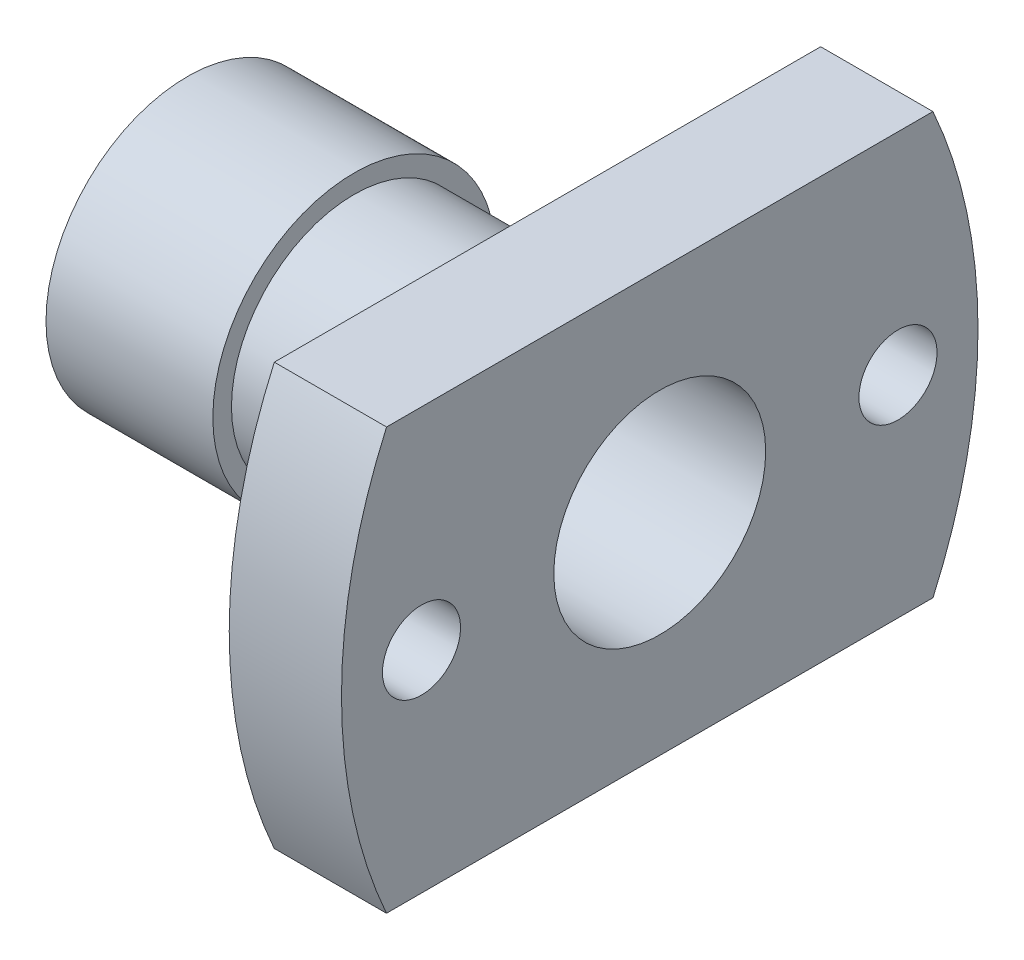
ISO-10303-21;
HEADER;
FILE_DESCRIPTION(('STEP AP214'),'2;1');
FILE_NAME('part.step','',(''),(''),'','','');
FILE_SCHEMA(('AUTOMOTIVE_DESIGN { 1 0 10303 214 1 1 1 1 }'));
ENDSEC;
DATA;
#1=APPLICATION_CONTEXT('core data for automotive mechanical design processes');
#2=APPLICATION_PROTOCOL_DEFINITION('international standard','automotive_design',2000,#1);
#3=PRODUCT_CONTEXT('',#1,'mechanical');
#4=PRODUCT('Part','Part','',(#3));
#5=PRODUCT_RELATED_PRODUCT_CATEGORY('part','',(#4));
#6=PRODUCT_DEFINITION_FORMATION('','',#4);
#7=PRODUCT_DEFINITION_CONTEXT('part definition',#1,'design');
#8=PRODUCT_DEFINITION('design','',#6,#7);
#9=PRODUCT_DEFINITION_SHAPE('','',#8);
#10=(LENGTH_UNIT() NAMED_UNIT(*) SI_UNIT(.MILLI.,.METRE.));
#11=(NAMED_UNIT(*) PLANE_ANGLE_UNIT() SI_UNIT($,.RADIAN.));
#12=(NAMED_UNIT(*) SI_UNIT($,.STERADIAN.) SOLID_ANGLE_UNIT());
#13=UNCERTAINTY_MEASURE_WITH_UNIT(LENGTH_MEASURE(1.E-05),#10,'distance_accuracy_value','');
#14=(GEOMETRIC_REPRESENTATION_CONTEXT(3) GLOBAL_UNCERTAINTY_ASSIGNED_CONTEXT((#13)) GLOBAL_UNIT_ASSIGNED_CONTEXT((#10,
#11,#12)) REPRESENTATION_CONTEXT('',''));
#15=CARTESIAN_POINT('',(0.,0.,0.));
#16=DIRECTION('',(0.,0.,1.));
#17=DIRECTION('',(1.,0.,0.));
#18=AXIS2_PLACEMENT_3D('',#15,#16,#17);
#19=CARTESIAN_POINT('',(-21.59,0.,-14.28));
#20=DIRECTION('',(1.,0.,0.));
#21=DIRECTION('',(0.,0.,-1.));
#22=AXIS2_PLACEMENT_3D('',#19,#20,#21);
#23=CYLINDRICAL_SURFACE('',#22,7.35);
#24=CARTESIAN_POINT('',(0.,0.,-14.28));
#25=DIRECTION('',(1.,0.,0.));
#26=DIRECTION('',(0.,0.,-1.));
#27=AXIS2_PLACEMENT_3D('',#24,#25,#26);
#28=CIRCLE('',#27,7.35);
#29=CARTESIAN_POINT('',(0.,0.,-21.63));
#30=VERTEX_POINT('',#29);
#31=EDGE_CURVE('E81',#30,#30,#28,.F.);
#32=ORIENTED_EDGE('',*,*,#31,.T.);
#33=EDGE_LOOP('',(#32));
#34=FACE_BOUND('',#33,.T.);
#35=CARTESIAN_POINT('',(-11.59,0.,-14.28));
#36=DIRECTION('',(-1.,0.,0.));
#37=DIRECTION('',(0.,0.,1.));
#38=AXIS2_PLACEMENT_3D('',#35,#36,#37);
#39=CIRCLE('',#38,7.35);
#40=CARTESIAN_POINT('',(-11.59,0.,-6.93));
#41=VERTEX_POINT('',#40);
#42=EDGE_CURVE('E12',#41,#41,#39,.T.);
#43=ORIENTED_EDGE('',*,*,#42,.F.);
#44=EDGE_LOOP('',(#43));
#45=FACE_BOUND('',#44,.T.);
#46=ADVANCED_FACE('F72',(#34,#45),#23,.T.);
#47=CARTESIAN_POINT('',(0.,0.,0.));
#48=DIRECTION('',(1.,0.,0.));
#49=DIRECTION('',(0.,0.,-1.));
#50=AXIS2_PLACEMENT_3D('',#47,#48,#49);
#51=PLANE('',#50);
#52=CARTESIAN_POINT('',(0.,0.,-2.5));
#53=DIRECTION('',(-1.,0.,0.));
#54=DIRECTION('',(0.,0.,1.));
#55=AXIS2_PLACEMENT_3D('',#52,#53,#54);
#56=CIRCLE('',#55,30.855);
#57=CARTESIAN_POINT('',(0.,12.625,-30.6538700714484));
#58=VERTEX_POINT('',#57);
#59=CARTESIAN_POINT('',(0.,-12.615,-30.6583522245177));
#60=VERTEX_POINT('',#59);
#61=EDGE_CURVE('E110',#58,#60,#56,.T.);
#62=ORIENTED_EDGE('',*,*,#61,.T.);
#63=DIRECTION('',(0.,0.,1.));
#64=VECTOR('',#63,1.);
#65=CARTESIAN_POINT('',(0.,-12.615,0.));
#66=LINE('',#65,#64);
#67=CARTESIAN_POINT('',(0.,-12.615,2.09835222451768));
#68=VERTEX_POINT('',#67);
#69=EDGE_CURVE('E115',#60,#68,#66,.T.);
#70=ORIENTED_EDGE('',*,*,#69,.T.);
#71=CARTESIAN_POINT('',(0.,0.,-26.06));
#72=DIRECTION('',(-1.,0.,0.));
#73=DIRECTION('',(0.,0.,1.));
#74=AXIS2_PLACEMENT_3D('',#71,#72,#73);
#75=CIRCLE('',#74,30.855);
#76=CARTESIAN_POINT('',(0.,12.625,2.09387007144844));
#77=VERTEX_POINT('',#76);
#78=EDGE_CURVE('E142',#68,#77,#75,.T.);
#79=ORIENTED_EDGE('',*,*,#78,.T.);
#80=DIRECTION('',(0.,0.,-1.));
#81=VECTOR('',#80,1.);
#82=CARTESIAN_POINT('',(0.,12.625,0.));
#83=LINE('',#82,#81);
#84=EDGE_CURVE('E118',#77,#58,#83,.T.);
#85=ORIENTED_EDGE('',*,*,#84,.T.);
#86=EDGE_LOOP('',(#62,#70,#79,#85));
#87=FACE_BOUND('',#86,.T.);
#88=ORIENTED_EDGE('',*,*,#31,.F.);
#89=EDGE_LOOP('',(#88));
#90=FACE_BOUND('',#89,.T.);
#91=CARTESIAN_POINT('',(0.,0.,-28.56));
#92=DIRECTION('',(-1.,0.,0.));
#93=DIRECTION('',(0.,0.,1.));
#94=AXIS2_PLACEMENT_3D('',#91,#92,#93);
#95=CIRCLE('',#94,2.34);
#96=CARTESIAN_POINT('',(0.,0.,-26.22));
#97=VERTEX_POINT('',#96);
#98=EDGE_CURVE('E163',#97,#97,#95,.T.);
#99=ORIENTED_EDGE('',*,*,#98,.F.);
#100=EDGE_LOOP('',(#99));
#101=FACE_BOUND('',#100,.T.);
#102=CARTESIAN_POINT('',(0.,0.,0.));
#103=DIRECTION('',(-1.,0.,0.));
#104=DIRECTION('',(0.,0.,1.));
#105=AXIS2_PLACEMENT_3D('',#102,#103,#104);
#106=CIRCLE('',#105,2.34);
#107=CARTESIAN_POINT('',(0.,0.,2.34));
#108=VERTEX_POINT('',#107);
#109=EDGE_CURVE('E169',#108,#108,#106,.T.);
#110=ORIENTED_EDGE('',*,*,#109,.F.);
#111=EDGE_LOOP('',(#110));
#112=FACE_BOUND('',#111,.T.);
#113=ADVANCED_FACE('F112',(#87,#90,#101,#112),#51,.F.);
#114=CARTESIAN_POINT('',(6.73,0.,0.));
#115=DIRECTION('',(1.,0.,0.));
#116=DIRECTION('',(0.,0.,-1.));
#117=AXIS2_PLACEMENT_3D('',#114,#115,#116);
#118=PLANE('',#117);
#119=CARTESIAN_POINT('',(6.73,0.,-14.28));
#120=DIRECTION('',(-1.,0.,0.));
#121=DIRECTION('',(0.,0.,1.));
#122=AXIS2_PLACEMENT_3D('',#119,#120,#121);
#123=CIRCLE('',#122,6.35);
#124=CARTESIAN_POINT('',(6.73,0.,-7.93));
#125=VERTEX_POINT('',#124);
#126=EDGE_CURVE('E126',#125,#125,#123,.T.);
#127=ORIENTED_EDGE('',*,*,#126,.T.);
#128=EDGE_LOOP('',(#127));
#129=FACE_BOUND('',#128,.T.);
#130=DIRECTION('',(0.,0.,1.));
#131=VECTOR('',#130,1.);
#132=CARTESIAN_POINT('',(6.73,-12.615,0.));
#133=LINE('',#132,#131);
#134=CARTESIAN_POINT('',(6.73,-12.615,-30.6583522245177));
#135=VERTEX_POINT('',#134);
#136=CARTESIAN_POINT('',(6.73,-12.615,2.09835222451768));
#137=VERTEX_POINT('',#136);
#138=EDGE_CURVE('E87',#135,#137,#133,.T.);
#139=ORIENTED_EDGE('',*,*,#138,.F.);
#140=CARTESIAN_POINT('',(6.73,0.,-2.5));
#141=DIRECTION('',(-1.,0.,0.));
#142=DIRECTION('',(0.,0.,1.));
#143=AXIS2_PLACEMENT_3D('',#140,#141,#142);
#144=CIRCLE('',#143,30.855);
#145=CARTESIAN_POINT('',(6.73,12.625,-30.6538700714484));
#146=VERTEX_POINT('',#145);
#147=EDGE_CURVE('E121',#146,#135,#144,.T.);
#148=ORIENTED_EDGE('',*,*,#147,.F.);
#149=DIRECTION('',(0.,0.,-1.));
#150=VECTOR('',#149,1.);
#151=CARTESIAN_POINT('',(6.73,12.625,0.));
#152=LINE('',#151,#150);
#153=CARTESIAN_POINT('',(6.73,12.625,2.09387007144844));
#154=VERTEX_POINT('',#153);
#155=EDGE_CURVE('E130',#154,#146,#152,.T.);
#156=ORIENTED_EDGE('',*,*,#155,.F.);
#157=CARTESIAN_POINT('',(6.73,0.,-26.06));
#158=DIRECTION('',(-1.,0.,0.));
#159=DIRECTION('',(0.,0.,1.));
#160=AXIS2_PLACEMENT_3D('',#157,#158,#159);
#161=CIRCLE('',#160,30.855);
#162=EDGE_CURVE('E141',#137,#154,#161,.T.);
#163=ORIENTED_EDGE('',*,*,#162,.F.);
#164=EDGE_LOOP('',(#139,#148,#156,#163));
#165=FACE_BOUND('',#164,.T.);
#166=CARTESIAN_POINT('',(6.73,0.,-28.56));
#167=DIRECTION('',(-1.,0.,0.));
#168=DIRECTION('',(0.,0.,1.));
#169=AXIS2_PLACEMENT_3D('',#166,#167,#168);
#170=CIRCLE('',#169,2.34);
#171=CARTESIAN_POINT('',(6.73,0.,-26.22));
#172=VERTEX_POINT('',#171);
#173=EDGE_CURVE('E160',#172,#172,#170,.T.);
#174=ORIENTED_EDGE('',*,*,#173,.T.);
#175=EDGE_LOOP('',(#174));
#176=FACE_BOUND('',#175,.T.);
#177=CARTESIAN_POINT('',(6.73,0.,0.));
#178=DIRECTION('',(-1.,0.,0.));
#179=DIRECTION('',(0.,0.,1.));
#180=AXIS2_PLACEMENT_3D('',#177,#178,#179);
#181=CIRCLE('',#180,2.34);
#182=CARTESIAN_POINT('',(6.73,0.,2.34));
#183=VERTEX_POINT('',#182);
#184=EDGE_CURVE('E166',#183,#183,#181,.T.);
#185=ORIENTED_EDGE('',*,*,#184,.T.);
#186=EDGE_LOOP('',(#185));
#187=FACE_BOUND('',#186,.T.);
#188=ADVANCED_FACE('F175',(#129,#165,#176,#187),#118,.T.);
#189=CARTESIAN_POINT('',(6.73,-12.615,0.));
#190=DIRECTION('',(0.,-1.,0.));
#191=DIRECTION('',(0.,0.,-1.));
#192=AXIS2_PLACEMENT_3D('',#189,#190,#191);
#193=PLANE('',#192);
#194=ORIENTED_EDGE('',*,*,#69,.F.);
#195=DIRECTION('',(-1.,0.,0.));
#196=VECTOR('',#195,1.);
#197=CARTESIAN_POINT('',(6.73,-12.615,-30.6583522245177));
#198=LINE('',#197,#196);
#199=EDGE_CURVE('E122',#135,#60,#198,.T.);
#200=ORIENTED_EDGE('',*,*,#199,.F.);
#201=ORIENTED_EDGE('',*,*,#138,.T.);
#202=DIRECTION('',(-1.,0.,0.));
#203=VECTOR('',#202,1.);
#204=CARTESIAN_POINT('',(6.73,-12.615,2.09835222451768));
#205=LINE('',#204,#203);
#206=EDGE_CURVE('E129',#137,#68,#205,.T.);
#207=ORIENTED_EDGE('',*,*,#206,.T.);
#208=EDGE_LOOP('',(#194,#200,#201,#207));
#209=FACE_BOUND('',#208,.T.);
#210=ADVANCED_FACE('F128',(#209),#193,.T.);
#211=CARTESIAN_POINT('',(6.73,12.625,0.));
#212=DIRECTION('',(0.,1.,0.));
#213=DIRECTION('',(0.,0.,1.));
#214=AXIS2_PLACEMENT_3D('',#211,#212,#213);
#215=PLANE('',#214);
#216=ORIENTED_EDGE('',*,*,#155,.T.);
#217=DIRECTION('',(-1.,0.,0.));
#218=VECTOR('',#217,1.);
#219=CARTESIAN_POINT('',(6.73,12.625,-30.6538700714484));
#220=LINE('',#219,#218);
#221=EDGE_CURVE('E148',#146,#58,#220,.T.);
#222=ORIENTED_EDGE('',*,*,#221,.T.);
#223=ORIENTED_EDGE('',*,*,#84,.F.);
#224=DIRECTION('',(-1.,0.,0.));
#225=VECTOR('',#224,1.);
#226=CARTESIAN_POINT('',(6.73,12.625,2.09387007144844));
#227=LINE('',#226,#225);
#228=EDGE_CURVE('E144',#154,#77,#227,.T.);
#229=ORIENTED_EDGE('',*,*,#228,.F.);
#230=EDGE_LOOP('',(#216,#222,#223,#229));
#231=FACE_BOUND('',#230,.T.);
#232=ADVANCED_FACE('F74',(#231),#215,.T.);
#233=CARTESIAN_POINT('',(6.73,0.,-26.06));
#234=DIRECTION('',(-1.,0.,0.));
#235=DIRECTION('',(0.,0.,1.));
#236=AXIS2_PLACEMENT_3D('',#233,#234,#235);
#237=CYLINDRICAL_SURFACE('',#236,30.855);
#238=ORIENTED_EDGE('',*,*,#78,.F.);
#239=ORIENTED_EDGE('',*,*,#206,.F.);
#240=ORIENTED_EDGE('',*,*,#162,.T.);
#241=ORIENTED_EDGE('',*,*,#228,.T.);
#242=EDGE_LOOP('',(#238,#239,#240,#241));
#243=FACE_BOUND('',#242,.T.);
#244=ADVANCED_FACE('F198',(#243),#237,.T.);
#245=CARTESIAN_POINT('',(6.73,0.,-2.5));
#246=DIRECTION('',(-1.,0.,0.));
#247=DIRECTION('',(0.,0.,1.));
#248=AXIS2_PLACEMENT_3D('',#245,#246,#247);
#249=CYLINDRICAL_SURFACE('',#248,30.855);
#250=ORIENTED_EDGE('',*,*,#61,.F.);
#251=ORIENTED_EDGE('',*,*,#221,.F.);
#252=ORIENTED_EDGE('',*,*,#147,.T.);
#253=ORIENTED_EDGE('',*,*,#199,.T.);
#254=EDGE_LOOP('',(#250,#251,#252,#253));
#255=FACE_BOUND('',#254,.T.);
#256=ADVANCED_FACE('F124',(#255),#249,.T.);
#257=CARTESIAN_POINT('',(-21.59,0.,0.));
#258=DIRECTION('',(-1.,0.,0.));
#259=DIRECTION('',(0.,0.,1.));
#260=AXIS2_PLACEMENT_3D('',#257,#258,#259);
#261=PLANE('',#260);
#262=CARTESIAN_POINT('',(-21.59,0.,-14.28));
#263=DIRECTION('',(-1.,0.,0.));
#264=DIRECTION('',(0.,0.,1.));
#265=AXIS2_PLACEMENT_3D('',#262,#263,#264);
#266=CIRCLE('',#265,6.35);
#267=CARTESIAN_POINT('',(-21.59,0.,-7.93));
#268=VERTEX_POINT('',#267);
#269=EDGE_CURVE('E151',#268,#268,#266,.T.);
#270=ORIENTED_EDGE('',*,*,#269,.F.);
#271=EDGE_LOOP('',(#270));
#272=FACE_BOUND('',#271,.T.);
#273=CARTESIAN_POINT('',(-21.59,0.,-14.28));
#274=DIRECTION('',(-1.,0.,0.));
#275=DIRECTION('',(0.,0.,1.));
#276=AXIS2_PLACEMENT_3D('',#273,#274,#275);
#277=CIRCLE('',#276,8.46662105648332);
#278=CARTESIAN_POINT('',(-21.59,0.,-5.81337894351668));
#279=VERTEX_POINT('',#278);
#280=EDGE_CURVE('E157',#279,#279,#277,.T.);
#281=ORIENTED_EDGE('',*,*,#280,.T.);
#282=EDGE_LOOP('',(#281));
#283=FACE_BOUND('',#282,.T.);
#284=ADVANCED_FACE('F230',(#272,#283),#261,.T.);
#285=CARTESIAN_POINT('',(6.73,0.,-14.28));
#286=DIRECTION('',(-1.,0.,0.));
#287=DIRECTION('',(0.,0.,1.));
#288=AXIS2_PLACEMENT_3D('',#285,#286,#287);
#289=CYLINDRICAL_SURFACE('',#288,6.35);
#290=ORIENTED_EDGE('',*,*,#126,.F.);
#291=EDGE_LOOP('',(#290));
#292=FACE_BOUND('',#291,.T.);
#293=ORIENTED_EDGE('',*,*,#269,.T.);
#294=EDGE_LOOP('',(#293));
#295=FACE_BOUND('',#294,.T.);
#296=ADVANCED_FACE('F226',(#292,#295),#289,.F.);
#297=CARTESIAN_POINT('',(-11.59,0.,-14.28));
#298=DIRECTION('',(-1.,0.,0.));
#299=DIRECTION('',(0.,0.,1.));
#300=AXIS2_PLACEMENT_3D('',#297,#298,#299);
#301=CYLINDRICAL_SURFACE('',#300,8.46662105648332);
#302=CARTESIAN_POINT('',(-11.59,0.,-14.28));
#303=DIRECTION('',(-1.,0.,0.));
#304=DIRECTION('',(0.,0.,1.));
#305=AXIS2_PLACEMENT_3D('',#302,#303,#304);
#306=CIRCLE('',#305,8.46662105648332);
#307=CARTESIAN_POINT('',(-11.59,0.,-5.81337894351668));
#308=VERTEX_POINT('',#307);
#309=EDGE_CURVE('E154',#308,#308,#306,.T.);
#310=ORIENTED_EDGE('',*,*,#309,.T.);
#311=EDGE_LOOP('',(#310));
#312=FACE_BOUND('',#311,.T.);
#313=ORIENTED_EDGE('',*,*,#280,.F.);
#314=EDGE_LOOP('',(#313));
#315=FACE_BOUND('',#314,.T.);
#316=ADVANCED_FACE('F220',(#312,#315),#301,.T.);
#317=CARTESIAN_POINT('',(-11.59,0.,-14.28));
#318=DIRECTION('',(-1.,0.,0.));
#319=DIRECTION('',(0.,0.,1.));
#320=AXIS2_PLACEMENT_3D('',#317,#318,#319);
#321=PLANE('',#320);
#322=ORIENTED_EDGE('',*,*,#42,.T.);
#323=EDGE_LOOP('',(#322));
#324=FACE_BOUND('',#323,.T.);
#325=ORIENTED_EDGE('',*,*,#309,.F.);
#326=EDGE_LOOP('',(#325));
#327=FACE_BOUND('',#326,.T.);
#328=ADVANCED_FACE('F213',(#324,#327),#321,.F.);
#329=CARTESIAN_POINT('',(6.73,0.,-28.56));
#330=DIRECTION('',(-1.,0.,0.));
#331=DIRECTION('',(0.,0.,1.));
#332=AXIS2_PLACEMENT_3D('',#329,#330,#331);
#333=CYLINDRICAL_SURFACE('',#332,2.34);
#334=ORIENTED_EDGE('',*,*,#173,.F.);
#335=EDGE_LOOP('',(#334));
#336=FACE_BOUND('',#335,.T.);
#337=ORIENTED_EDGE('',*,*,#98,.T.);
#338=EDGE_LOOP('',(#337));
#339=FACE_BOUND('',#338,.T.);
#340=ADVANCED_FACE('F180',(#336,#339),#333,.F.);
#341=CARTESIAN_POINT('',(6.73,0.,0.));
#342=DIRECTION('',(-1.,0.,0.));
#343=DIRECTION('',(0.,0.,1.));
#344=AXIS2_PLACEMENT_3D('',#341,#342,#343);
#345=CYLINDRICAL_SURFACE('',#344,2.34);
#346=ORIENTED_EDGE('',*,*,#184,.F.);
#347=EDGE_LOOP('',(#346));
#348=FACE_BOUND('',#347,.T.);
#349=ORIENTED_EDGE('',*,*,#109,.T.);
#350=EDGE_LOOP('',(#349));
#351=FACE_BOUND('',#350,.T.);
#352=ADVANCED_FACE('F177',(#348,#351),#345,.F.);
#353=CLOSED_SHELL('',(#46,#113,#188,#210,#232,#244,#256,#284,#296,#316,#328,#340,#352));
#354=MANIFOLD_SOLID_BREP('B2',#353);
#355=ADVANCED_BREP_SHAPE_REPRESENTATION('',(#18,#354),#14);
#356=SHAPE_DEFINITION_REPRESENTATION(#9,#355);
ENDSEC;
END-ISO-10303-21;
